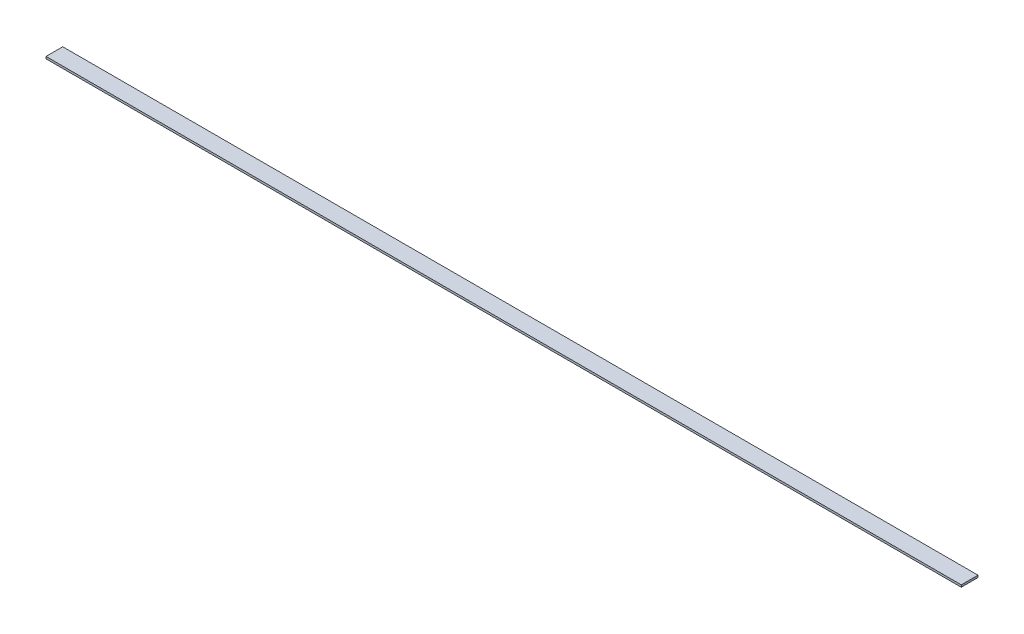
ISO-10303-21;
HEADER;
FILE_DESCRIPTION(('STEP AP214'),'2;1');
FILE_NAME('part.step','',(''),(''),'','','');
FILE_SCHEMA(('AUTOMOTIVE_DESIGN { 1 0 10303 214 1 1 1 1 }'));
ENDSEC;
DATA;
#1=APPLICATION_CONTEXT('core data for automotive mechanical design processes');
#2=APPLICATION_PROTOCOL_DEFINITION('international standard','automotive_design',2000,#1);
#3=PRODUCT_CONTEXT('',#1,'mechanical');
#4=PRODUCT('Part','Part','',(#3));
#5=PRODUCT_RELATED_PRODUCT_CATEGORY('part','',(#4));
#6=PRODUCT_DEFINITION_FORMATION('','',#4);
#7=PRODUCT_DEFINITION_CONTEXT('part definition',#1,'design');
#8=PRODUCT_DEFINITION('design','',#6,#7);
#9=PRODUCT_DEFINITION_SHAPE('','',#8);
#10=(LENGTH_UNIT() NAMED_UNIT(*) SI_UNIT(.MILLI.,.METRE.));
#11=(NAMED_UNIT(*) PLANE_ANGLE_UNIT() SI_UNIT($,.RADIAN.));
#12=(NAMED_UNIT(*) SI_UNIT($,.STERADIAN.) SOLID_ANGLE_UNIT());
#13=UNCERTAINTY_MEASURE_WITH_UNIT(LENGTH_MEASURE(1.E-05),#10,'distance_accuracy_value','');
#14=(GEOMETRIC_REPRESENTATION_CONTEXT(3) GLOBAL_UNCERTAINTY_ASSIGNED_CONTEXT((#13)) GLOBAL_UNIT_ASSIGNED_CONTEXT((#10,
#11,#12)) REPRESENTATION_CONTEXT('',''));
#15=CARTESIAN_POINT('',(0.,0.,0.));
#16=DIRECTION('',(0.,0.,1.));
#17=DIRECTION('',(1.,0.,0.));
#18=AXIS2_PLACEMENT_3D('',#15,#16,#17);
#19=CARTESIAN_POINT('',(546.500000000001,2.5,-10.));
#20=DIRECTION('',(-1.,0.,0.));
#21=DIRECTION('',(0.,0.,1.));
#22=AXIS2_PLACEMENT_3D('',#19,#20,#21);
#23=PLANE('',#22);
#24=DIRECTION('',(0.,0.,-1.));
#25=VECTOR('',#24,1.);
#26=CARTESIAN_POINT('',(546.500000000001,0.,-10.));
#27=LINE('',#26,#25);
#28=CARTESIAN_POINT('',(546.500000000001,0.,10.));
#29=VERTEX_POINT('',#28);
#30=CARTESIAN_POINT('',(546.500000000001,0.,-10.));
#31=VERTEX_POINT('',#30);
#32=EDGE_CURVE('E97',#29,#31,#27,.T.);
#33=ORIENTED_EDGE('',*,*,#32,.T.);
#34=DIRECTION('',(0.,-1.,0.));
#35=VECTOR('',#34,1.);
#36=CARTESIAN_POINT('',(546.500000000001,2.5,-10.));
#37=LINE('',#36,#35);
#38=CARTESIAN_POINT('',(546.500000000001,2.5,-10.));
#39=VERTEX_POINT('',#38);
#40=EDGE_CURVE('E11',#39,#31,#37,.T.);
#41=ORIENTED_EDGE('',*,*,#40,.F.);
#42=DIRECTION('',(0.,0.,-1.));
#43=VECTOR('',#42,1.);
#44=CARTESIAN_POINT('',(546.500000000001,2.5,-10.));
#45=LINE('',#44,#43);
#46=CARTESIAN_POINT('',(546.500000000001,2.5,10.));
#47=VERTEX_POINT('',#46);
#48=EDGE_CURVE('E85',#47,#39,#45,.T.);
#49=ORIENTED_EDGE('',*,*,#48,.F.);
#50=DIRECTION('',(0.,-1.,0.));
#51=VECTOR('',#50,1.);
#52=CARTESIAN_POINT('',(546.500000000001,2.5,10.));
#53=LINE('',#52,#51);
#54=EDGE_CURVE('E93',#47,#29,#53,.T.);
#55=ORIENTED_EDGE('',*,*,#54,.T.);
#56=EDGE_LOOP('',(#33,#41,#49,#55));
#57=FACE_BOUND('',#56,.T.);
#58=ADVANCED_FACE('F34',(#57),#23,.F.);
#59=CARTESIAN_POINT('',(-546.499999999999,2.5,-10.));
#60=DIRECTION('',(0.,0.,1.));
#61=DIRECTION('',(1.,0.,0.));
#62=AXIS2_PLACEMENT_3D('',#59,#60,#61);
#63=PLANE('',#62);
#64=DIRECTION('',(-1.,0.,0.));
#65=VECTOR('',#64,1.);
#66=CARTESIAN_POINT('',(-546.499999999999,0.,-10.));
#67=LINE('',#66,#65);
#68=CARTESIAN_POINT('',(-546.499999999999,0.,-10.));
#69=VERTEX_POINT('',#68);
#70=EDGE_CURVE('E89',#31,#69,#67,.T.);
#71=ORIENTED_EDGE('',*,*,#70,.T.);
#72=DIRECTION('',(0.,-1.,0.));
#73=VECTOR('',#72,1.);
#74=CARTESIAN_POINT('',(-546.499999999999,2.5,-10.));
#75=LINE('',#74,#73);
#76=CARTESIAN_POINT('',(-546.499999999999,2.5,-10.));
#77=VERTEX_POINT('',#76);
#78=EDGE_CURVE('E42',#77,#69,#75,.T.);
#79=ORIENTED_EDGE('',*,*,#78,.F.);
#80=DIRECTION('',(-1.,0.,0.));
#81=VECTOR('',#80,1.);
#82=CARTESIAN_POINT('',(-546.499999999999,2.5,-10.));
#83=LINE('',#82,#81);
#84=EDGE_CURVE('E80',#39,#77,#83,.T.);
#85=ORIENTED_EDGE('',*,*,#84,.F.);
#86=ORIENTED_EDGE('',*,*,#40,.T.);
#87=EDGE_LOOP('',(#71,#79,#85,#86));
#88=FACE_BOUND('',#87,.T.);
#89=ADVANCED_FACE('F88',(#88),#63,.F.);
#90=CARTESIAN_POINT('',(-546.499999999999,2.5,-10.));
#91=DIRECTION('',(1.,0.,0.));
#92=DIRECTION('',(0.,0.,-1.));
#93=AXIS2_PLACEMENT_3D('',#90,#91,#92);
#94=PLANE('',#93);
#95=DIRECTION('',(0.,0.,1.));
#96=VECTOR('',#95,1.);
#97=CARTESIAN_POINT('',(-546.499999999999,0.,-10.));
#98=LINE('',#97,#96);
#99=CARTESIAN_POINT('',(-546.499999999999,0.,10.));
#100=VERTEX_POINT('',#99);
#101=EDGE_CURVE('E67',#69,#100,#98,.T.);
#102=ORIENTED_EDGE('',*,*,#101,.T.);
#103=DIRECTION('',(0.,-1.,0.));
#104=VECTOR('',#103,1.);
#105=CARTESIAN_POINT('',(-546.499999999999,2.5,10.));
#106=LINE('',#105,#104);
#107=CARTESIAN_POINT('',(-546.499999999999,2.5,10.));
#108=VERTEX_POINT('',#107);
#109=EDGE_CURVE('E90',#108,#100,#106,.T.);
#110=ORIENTED_EDGE('',*,*,#109,.F.);
#111=DIRECTION('',(0.,0.,1.));
#112=VECTOR('',#111,1.);
#113=CARTESIAN_POINT('',(-546.499999999999,2.5,-10.));
#114=LINE('',#113,#112);
#115=EDGE_CURVE('E83',#77,#108,#114,.T.);
#116=ORIENTED_EDGE('',*,*,#115,.F.);
#117=ORIENTED_EDGE('',*,*,#78,.T.);
#118=EDGE_LOOP('',(#102,#110,#116,#117));
#119=FACE_BOUND('',#118,.T.);
#120=ADVANCED_FACE('F91',(#119),#94,.F.);
#121=CARTESIAN_POINT('',(-546.499999999999,2.5,10.));
#122=DIRECTION('',(0.,0.,-1.));
#123=DIRECTION('',(-1.,0.,0.));
#124=AXIS2_PLACEMENT_3D('',#121,#122,#123);
#125=PLANE('',#124);
#126=DIRECTION('',(1.,0.,0.));
#127=VECTOR('',#126,1.);
#128=CARTESIAN_POINT('',(-546.499999999999,0.,10.));
#129=LINE('',#128,#127);
#130=EDGE_CURVE('E73',#100,#29,#129,.T.);
#131=ORIENTED_EDGE('',*,*,#130,.T.);
#132=ORIENTED_EDGE('',*,*,#54,.F.);
#133=DIRECTION('',(1.,0.,0.));
#134=VECTOR('',#133,1.);
#135=CARTESIAN_POINT('',(-546.499999999999,2.5,10.));
#136=LINE('',#135,#134);
#137=EDGE_CURVE('E50',#108,#47,#136,.T.);
#138=ORIENTED_EDGE('',*,*,#137,.F.);
#139=ORIENTED_EDGE('',*,*,#109,.T.);
#140=EDGE_LOOP('',(#131,#132,#138,#139));
#141=FACE_BOUND('',#140,.T.);
#142=ADVANCED_FACE('F104',(#141),#125,.F.);
#143=CARTESIAN_POINT('',(0.,2.5,0.));
#144=DIRECTION('',(0.,1.,0.));
#145=DIRECTION('',(0.,0.,1.));
#146=AXIS2_PLACEMENT_3D('',#143,#144,#145);
#147=PLANE('',#146);
#148=ORIENTED_EDGE('',*,*,#48,.T.);
#149=ORIENTED_EDGE('',*,*,#84,.T.);
#150=ORIENTED_EDGE('',*,*,#115,.T.);
#151=ORIENTED_EDGE('',*,*,#137,.T.);
#152=EDGE_LOOP('',(#148,#149,#150,#151));
#153=FACE_BOUND('',#152,.T.);
#154=ADVANCED_FACE('F81',(#153),#147,.T.);
#155=CARTESIAN_POINT('',(0.,0.,0.));
#156=DIRECTION('',(0.,1.,0.));
#157=DIRECTION('',(0.,0.,1.));
#158=AXIS2_PLACEMENT_3D('',#155,#156,#157);
#159=PLANE('',#158);
#160=ORIENTED_EDGE('',*,*,#32,.F.);
#161=ORIENTED_EDGE('',*,*,#130,.F.);
#162=ORIENTED_EDGE('',*,*,#101,.F.);
#163=ORIENTED_EDGE('',*,*,#70,.F.);
#164=EDGE_LOOP('',(#160,#161,#162,#163));
#165=FACE_BOUND('',#164,.T.);
#166=ADVANCED_FACE('F107',(#165),#159,.F.);
#167=CLOSED_SHELL('',(#58,#89,#120,#142,#154,#166));
#168=MANIFOLD_SOLID_BREP('B2',#167);
#169=ADVANCED_BREP_SHAPE_REPRESENTATION('',(#18,#168),#14);
#170=SHAPE_DEFINITION_REPRESENTATION(#9,#169);
ENDSEC;
END-ISO-10303-21;
